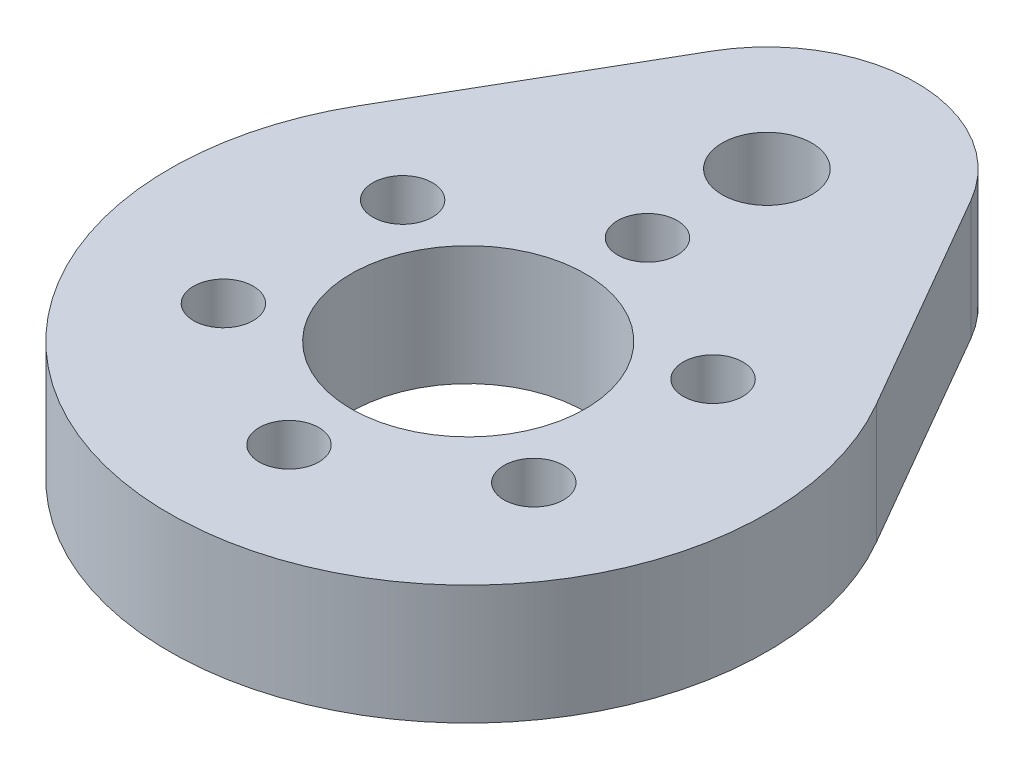
ISO-10303-21;
HEADER;
FILE_DESCRIPTION(('STEP AP214'),'2;1');
FILE_NAME('part.step','',(''),(''),'','','');
FILE_SCHEMA(('AUTOMOTIVE_DESIGN { 1 0 10303 214 1 1 1 1 }'));
ENDSEC;
DATA;
#1=APPLICATION_CONTEXT('core data for automotive mechanical design processes');
#2=APPLICATION_PROTOCOL_DEFINITION('international standard','automotive_design',2000,#1);
#3=PRODUCT_CONTEXT('',#1,'mechanical');
#4=PRODUCT('Part','Part','',(#3));
#5=PRODUCT_RELATED_PRODUCT_CATEGORY('part','',(#4));
#6=PRODUCT_DEFINITION_FORMATION('','',#4);
#7=PRODUCT_DEFINITION_CONTEXT('part definition',#1,'design');
#8=PRODUCT_DEFINITION('design','',#6,#7);
#9=PRODUCT_DEFINITION_SHAPE('','',#8);
#10=(LENGTH_UNIT() NAMED_UNIT(*) SI_UNIT(.MILLI.,.METRE.));
#11=(NAMED_UNIT(*) PLANE_ANGLE_UNIT() SI_UNIT($,.RADIAN.));
#12=(NAMED_UNIT(*) SI_UNIT($,.STERADIAN.) SOLID_ANGLE_UNIT());
#13=UNCERTAINTY_MEASURE_WITH_UNIT(LENGTH_MEASURE(1.E-05),#10,'distance_accuracy_value','');
#14=(GEOMETRIC_REPRESENTATION_CONTEXT(3) GLOBAL_UNCERTAINTY_ASSIGNED_CONTEXT((#13)) GLOBAL_UNIT_ASSIGNED_CONTEXT((#10,
#11,#12)) REPRESENTATION_CONTEXT('',''));
#15=CARTESIAN_POINT('',(0.,0.,0.));
#16=DIRECTION('',(0.,0.,1.));
#17=DIRECTION('',(1.,0.,0.));
#18=AXIS2_PLACEMENT_3D('',#15,#16,#17);
#19=CARTESIAN_POINT('',(0.,5.08,-12.7));
#20=DIRECTION('',(0.,1.,0.));
#21=DIRECTION('',(0.,0.,1.));
#22=AXIS2_PLACEMENT_3D('',#19,#20,#21);
#23=PLANE('',#22);
#24=CARTESIAN_POINT('',(-6.59911357683742,5.08,-3.80999999999999));
#25=DIRECTION('',(0.,1.,0.));
#26=DIRECTION('',(0.,0.,1.));
#27=AXIS2_PLACEMENT_3D('',#24,#25,#26);
#28=CIRCLE('',#27,1.27);
#29=CARTESIAN_POINT('',(-6.59911357683742,5.08,-2.53999999999999));
#30=VERTEX_POINT('',#29);
#31=EDGE_CURVE('E180',#30,#30,#28,.T.);
#32=ORIENTED_EDGE('',*,*,#31,.F.);
#33=EDGE_LOOP('',(#32));
#34=FACE_BOUND('',#33,.T.);
#35=CARTESIAN_POINT('',(0.,5.08,7.62));
#36=DIRECTION('',(0.,1.,0.));
#37=DIRECTION('',(0.,0.,1.));
#38=AXIS2_PLACEMENT_3D('',#35,#36,#37);
#39=CIRCLE('',#38,1.27);
#40=CARTESIAN_POINT('',(0.,5.08,8.89));
#41=VERTEX_POINT('',#40);
#42=EDGE_CURVE('E164',#41,#41,#39,.T.);
#43=ORIENTED_EDGE('',*,*,#42,.F.);
#44=EDGE_LOOP('',(#43));
#45=FACE_BOUND('',#44,.T.);
#46=CARTESIAN_POINT('',(6.59911357683742,5.08,-3.81));
#47=DIRECTION('',(0.,1.,0.));
#48=DIRECTION('',(0.,0.,1.));
#49=AXIS2_PLACEMENT_3D('',#46,#47,#48);
#50=CIRCLE('',#49,1.27);
#51=CARTESIAN_POINT('',(6.59911357683742,5.08,-2.54));
#52=VERTEX_POINT('',#51);
#53=EDGE_CURVE('E148',#52,#52,#50,.T.);
#54=ORIENTED_EDGE('',*,*,#53,.F.);
#55=EDGE_LOOP('',(#54));
#56=FACE_BOUND('',#55,.T.);
#57=CARTESIAN_POINT('',(0.,5.08,0.));
#58=DIRECTION('',(0.,1.,0.));
#59=DIRECTION('',(0.,0.,1.));
#60=AXIS2_PLACEMENT_3D('',#57,#58,#59);
#61=CIRCLE('',#60,4.97915669921389);
#62=CARTESIAN_POINT('',(0.,5.08,4.97915669921389));
#63=VERTEX_POINT('',#62);
#64=EDGE_CURVE('E118',#63,#63,#61,.T.);
#65=ORIENTED_EDGE('',*,*,#64,.F.);
#66=EDGE_LOOP('',(#65));
#67=FACE_BOUND('',#66,.T.);
#68=CARTESIAN_POINT('',(0.,5.08,-12.7));
#69=DIRECTION('',(0.,1.,0.));
#70=DIRECTION('',(0.,0.,1.));
#71=AXIS2_PLACEMENT_3D('',#68,#69,#70);
#72=CIRCLE('',#71,6.35);
#73=CARTESIAN_POINT('',(5.49926131403119,5.08,-15.875));
#74=VERTEX_POINT('',#73);
#75=CARTESIAN_POINT('',(-5.49926131403119,5.08,-15.875));
#76=VERTEX_POINT('',#75);
#77=EDGE_CURVE('E98',#74,#76,#72,.T.);
#78=ORIENTED_EDGE('',*,*,#77,.T.);
#79=DIRECTION('',(-0.5,0.,0.866025403784439));
#80=VECTOR('',#79,1.);
#81=CARTESIAN_POINT('',(-5.49926131403119,5.08,-15.875));
#82=LINE('',#81,#80);
#83=CARTESIAN_POINT('',(-10.9985226280624,5.08,-6.35));
#84=VERTEX_POINT('',#83);
#85=EDGE_CURVE('E93',#76,#84,#82,.T.);
#86=ORIENTED_EDGE('',*,*,#85,.T.);
#87=CARTESIAN_POINT('',(0.,5.08,0.));
#88=DIRECTION('',(0.,1.,0.));
#89=DIRECTION('',(0.,0.,1.));
#90=AXIS2_PLACEMENT_3D('',#87,#88,#89);
#91=CIRCLE('',#90,12.7);
#92=CARTESIAN_POINT('',(10.9985226280624,5.08,-6.35000000000001));
#93=VERTEX_POINT('',#92);
#94=EDGE_CURVE('E96',#84,#93,#91,.T.);
#95=ORIENTED_EDGE('',*,*,#94,.T.);
#96=DIRECTION('',(-0.5,0.,-0.866025403784439));
#97=VECTOR('',#96,1.);
#98=CARTESIAN_POINT('',(5.49926131403119,5.08,-15.875));
#99=LINE('',#98,#97);
#100=EDGE_CURVE('E63',#93,#74,#99,.T.);
#101=ORIENTED_EDGE('',*,*,#100,.T.);
#102=EDGE_LOOP('',(#78,#86,#95,#101));
#103=FACE_BOUND('',#102,.T.);
#104=CARTESIAN_POINT('',(0.,5.08,-7.62));
#105=DIRECTION('',(0.,1.,0.));
#106=DIRECTION('',(0.,0.,1.));
#107=AXIS2_PLACEMENT_3D('',#104,#105,#106);
#108=CIRCLE('',#107,1.27);
#109=CARTESIAN_POINT('',(0.,5.08,-6.35));
#110=VERTEX_POINT('',#109);
#111=EDGE_CURVE('E140',#110,#110,#108,.T.);
#112=ORIENTED_EDGE('',*,*,#111,.F.);
#113=EDGE_LOOP('',(#112));
#114=FACE_BOUND('',#113,.T.);
#115=CARTESIAN_POINT('',(6.59911357683742,5.08,3.81));
#116=DIRECTION('',(0.,1.,0.));
#117=DIRECTION('',(0.,0.,1.));
#118=AXIS2_PLACEMENT_3D('',#115,#116,#117);
#119=CIRCLE('',#118,1.27);
#120=CARTESIAN_POINT('',(6.59911357683742,5.08,5.08));
#121=VERTEX_POINT('',#120);
#122=EDGE_CURVE('E156',#121,#121,#119,.T.);
#123=ORIENTED_EDGE('',*,*,#122,.F.);
#124=EDGE_LOOP('',(#123));
#125=FACE_BOUND('',#124,.T.);
#126=CARTESIAN_POINT('',(-6.59911357683742,5.08,3.81));
#127=DIRECTION('',(0.,1.,0.));
#128=DIRECTION('',(0.,0.,1.));
#129=AXIS2_PLACEMENT_3D('',#126,#127,#128);
#130=CIRCLE('',#129,1.27);
#131=CARTESIAN_POINT('',(-6.59911357683742,5.08,5.08));
#132=VERTEX_POINT('',#131);
#133=EDGE_CURVE('E172',#132,#132,#130,.T.);
#134=ORIENTED_EDGE('',*,*,#133,.F.);
#135=EDGE_LOOP('',(#134));
#136=FACE_BOUND('',#135,.T.);
#137=CARTESIAN_POINT('',(0.,5.08,-12.7));
#138=DIRECTION('',(0.,1.,0.));
#139=DIRECTION('',(0.,0.,1.));
#140=AXIS2_PLACEMENT_3D('',#137,#138,#139);
#141=CIRCLE('',#140,1.905);
#142=CARTESIAN_POINT('',(0.,5.08,-10.795));
#143=VERTEX_POINT('',#142);
#144=EDGE_CURVE('E188',#143,#143,#141,.T.);
#145=ORIENTED_EDGE('',*,*,#144,.F.);
#146=EDGE_LOOP('',(#145));
#147=FACE_BOUND('',#146,.T.);
#148=ADVANCED_FACE('F45',(#34,#45,#56,#67,#103,#114,#125,#136,#147),#23,.T.);
#149=CARTESIAN_POINT('',(0.,0.,-12.7));
#150=DIRECTION('',(0.,1.,0.));
#151=DIRECTION('',(0.,0.,1.));
#152=AXIS2_PLACEMENT_3D('',#149,#150,#151);
#153=PLANE('',#152);
#154=CARTESIAN_POINT('',(0.,0.,-12.7));
#155=DIRECTION('',(0.,1.,0.));
#156=DIRECTION('',(0.,0.,1.));
#157=AXIS2_PLACEMENT_3D('',#154,#155,#156);
#158=CIRCLE('',#157,6.35);
#159=CARTESIAN_POINT('',(5.49926131403119,0.,-15.875));
#160=VERTEX_POINT('',#159);
#161=CARTESIAN_POINT('',(-5.49926131403119,0.,-15.875));
#162=VERTEX_POINT('',#161);
#163=EDGE_CURVE('E114',#160,#162,#158,.T.);
#164=ORIENTED_EDGE('',*,*,#163,.F.);
#165=DIRECTION('',(-0.5,0.,-0.866025403784439));
#166=VECTOR('',#165,1.);
#167=CARTESIAN_POINT('',(5.49926131403119,0.,-15.875));
#168=LINE('',#167,#166);
#169=CARTESIAN_POINT('',(10.9985226280624,0.,-6.35000000000001));
#170=VERTEX_POINT('',#169);
#171=EDGE_CURVE('E86',#170,#160,#168,.T.);
#172=ORIENTED_EDGE('',*,*,#171,.F.);
#173=CARTESIAN_POINT('',(0.,0.,0.));
#174=DIRECTION('',(0.,1.,0.));
#175=DIRECTION('',(0.,0.,1.));
#176=AXIS2_PLACEMENT_3D('',#173,#174,#175);
#177=CIRCLE('',#176,12.7);
#178=CARTESIAN_POINT('',(-10.9985226280624,0.,-6.35));
#179=VERTEX_POINT('',#178);
#180=EDGE_CURVE('E80',#179,#170,#177,.T.);
#181=ORIENTED_EDGE('',*,*,#180,.F.);
#182=DIRECTION('',(-0.5,0.,0.866025403784439));
#183=VECTOR('',#182,1.);
#184=CARTESIAN_POINT('',(-5.49926131403119,0.,-15.875));
#185=LINE('',#184,#183);
#186=EDGE_CURVE('E103',#162,#179,#185,.T.);
#187=ORIENTED_EDGE('',*,*,#186,.F.);
#188=EDGE_LOOP('',(#164,#172,#181,#187));
#189=FACE_BOUND('',#188,.T.);
#190=CARTESIAN_POINT('',(0.,0.,0.));
#191=DIRECTION('',(0.,1.,0.));
#192=DIRECTION('',(0.,0.,1.));
#193=AXIS2_PLACEMENT_3D('',#190,#191,#192);
#194=CIRCLE('',#193,4.97915669921389);
#195=CARTESIAN_POINT('',(0.,0.,4.97915669921389));
#196=VERTEX_POINT('',#195);
#197=EDGE_CURVE('E136',#196,#196,#194,.T.);
#198=ORIENTED_EDGE('',*,*,#197,.T.);
#199=EDGE_LOOP('',(#198));
#200=FACE_BOUND('',#199,.T.);
#201=CARTESIAN_POINT('',(0.,0.,-7.62));
#202=DIRECTION('',(0.,1.,0.));
#203=DIRECTION('',(0.,0.,1.));
#204=AXIS2_PLACEMENT_3D('',#201,#202,#203);
#205=CIRCLE('',#204,1.27);
#206=CARTESIAN_POINT('',(0.,0.,-6.35));
#207=VERTEX_POINT('',#206);
#208=EDGE_CURVE('E144',#207,#207,#205,.T.);
#209=ORIENTED_EDGE('',*,*,#208,.T.);
#210=EDGE_LOOP('',(#209));
#211=FACE_BOUND('',#210,.T.);
#212=CARTESIAN_POINT('',(6.59911357683742,0.,-3.81));
#213=DIRECTION('',(0.,1.,0.));
#214=DIRECTION('',(0.,0.,1.));
#215=AXIS2_PLACEMENT_3D('',#212,#213,#214);
#216=CIRCLE('',#215,1.27);
#217=CARTESIAN_POINT('',(6.59911357683742,0.,-2.54));
#218=VERTEX_POINT('',#217);
#219=EDGE_CURVE('E152',#218,#218,#216,.T.);
#220=ORIENTED_EDGE('',*,*,#219,.T.);
#221=EDGE_LOOP('',(#220));
#222=FACE_BOUND('',#221,.T.);
#223=CARTESIAN_POINT('',(6.59911357683742,0.,3.81));
#224=DIRECTION('',(0.,1.,0.));
#225=DIRECTION('',(0.,0.,1.));
#226=AXIS2_PLACEMENT_3D('',#223,#224,#225);
#227=CIRCLE('',#226,1.27);
#228=CARTESIAN_POINT('',(6.59911357683742,0.,5.08));
#229=VERTEX_POINT('',#228);
#230=EDGE_CURVE('E160',#229,#229,#227,.T.);
#231=ORIENTED_EDGE('',*,*,#230,.T.);
#232=EDGE_LOOP('',(#231));
#233=FACE_BOUND('',#232,.T.);
#234=CARTESIAN_POINT('',(0.,0.,7.62));
#235=DIRECTION('',(0.,1.,0.));
#236=DIRECTION('',(0.,0.,1.));
#237=AXIS2_PLACEMENT_3D('',#234,#235,#236);
#238=CIRCLE('',#237,1.27);
#239=CARTESIAN_POINT('',(0.,0.,8.89));
#240=VERTEX_POINT('',#239);
#241=EDGE_CURVE('E168',#240,#240,#238,.T.);
#242=ORIENTED_EDGE('',*,*,#241,.T.);
#243=EDGE_LOOP('',(#242));
#244=FACE_BOUND('',#243,.T.);
#245=CARTESIAN_POINT('',(-6.59911357683742,0.,3.81));
#246=DIRECTION('',(0.,1.,0.));
#247=DIRECTION('',(0.,0.,1.));
#248=AXIS2_PLACEMENT_3D('',#245,#246,#247);
#249=CIRCLE('',#248,1.27);
#250=CARTESIAN_POINT('',(-6.59911357683742,0.,5.08));
#251=VERTEX_POINT('',#250);
#252=EDGE_CURVE('E176',#251,#251,#249,.T.);
#253=ORIENTED_EDGE('',*,*,#252,.T.);
#254=EDGE_LOOP('',(#253));
#255=FACE_BOUND('',#254,.T.);
#256=CARTESIAN_POINT('',(-6.59911357683742,0.,-3.80999999999999));
#257=DIRECTION('',(0.,1.,0.));
#258=DIRECTION('',(0.,0.,1.));
#259=AXIS2_PLACEMENT_3D('',#256,#257,#258);
#260=CIRCLE('',#259,1.27);
#261=CARTESIAN_POINT('',(-6.59911357683742,0.,-2.53999999999999));
#262=VERTEX_POINT('',#261);
#263=EDGE_CURVE('E184',#262,#262,#260,.T.);
#264=ORIENTED_EDGE('',*,*,#263,.T.);
#265=EDGE_LOOP('',(#264));
#266=FACE_BOUND('',#265,.T.);
#267=CARTESIAN_POINT('',(0.,0.,-12.7));
#268=DIRECTION('',(0.,1.,0.));
#269=DIRECTION('',(0.,0.,1.));
#270=AXIS2_PLACEMENT_3D('',#267,#268,#269);
#271=CIRCLE('',#270,1.905);
#272=CARTESIAN_POINT('',(0.,0.,-10.795));
#273=VERTEX_POINT('',#272);
#274=EDGE_CURVE('E192',#273,#273,#271,.T.);
#275=ORIENTED_EDGE('',*,*,#274,.T.);
#276=EDGE_LOOP('',(#275));
#277=FACE_BOUND('',#276,.T.);
#278=ADVANCED_FACE('F131',(#189,#200,#211,#222,#233,#244,#255,#266,#277),#153,.F.);
#279=CARTESIAN_POINT('',(0.,5.08,-12.7));
#280=DIRECTION('',(0.,-1.,0.));
#281=DIRECTION('',(0.,0.,-1.));
#282=AXIS2_PLACEMENT_3D('',#279,#280,#281);
#283=CYLINDRICAL_SURFACE('',#282,6.35);
#284=ORIENTED_EDGE('',*,*,#163,.T.);
#285=DIRECTION('',(0.,-1.,0.));
#286=VECTOR('',#285,1.);
#287=CARTESIAN_POINT('',(-5.49926131403119,5.08,-15.875));
#288=LINE('',#287,#286);
#289=EDGE_CURVE('E11',#76,#162,#288,.T.);
#290=ORIENTED_EDGE('',*,*,#289,.F.);
#291=ORIENTED_EDGE('',*,*,#77,.F.);
#292=DIRECTION('',(0.,-1.,0.));
#293=VECTOR('',#292,1.);
#294=CARTESIAN_POINT('',(5.49926131403119,5.08,-15.875));
#295=LINE('',#294,#293);
#296=EDGE_CURVE('E110',#74,#160,#295,.T.);
#297=ORIENTED_EDGE('',*,*,#296,.T.);
#298=EDGE_LOOP('',(#284,#290,#291,#297));
#299=FACE_BOUND('',#298,.T.);
#300=ADVANCED_FACE('F47',(#299),#283,.T.);
#301=CARTESIAN_POINT('',(-5.49926131403119,5.08,-15.875));
#302=DIRECTION('',(0.866025403784439,0.,0.5));
#303=DIRECTION('',(0.5,0.,-0.866025403784439));
#304=AXIS2_PLACEMENT_3D('',#301,#302,#303);
#305=PLANE('',#304);
#306=ORIENTED_EDGE('',*,*,#186,.T.);
#307=DIRECTION('',(0.,-1.,0.));
#308=VECTOR('',#307,1.);
#309=CARTESIAN_POINT('',(-10.9985226280624,5.08,-6.35));
#310=LINE('',#309,#308);
#311=EDGE_CURVE('E55',#84,#179,#310,.T.);
#312=ORIENTED_EDGE('',*,*,#311,.F.);
#313=ORIENTED_EDGE('',*,*,#85,.F.);
#314=ORIENTED_EDGE('',*,*,#289,.T.);
#315=EDGE_LOOP('',(#306,#312,#313,#314));
#316=FACE_BOUND('',#315,.T.);
#317=ADVANCED_FACE('F102',(#316),#305,.F.);
#318=CARTESIAN_POINT('',(0.,5.08,0.));
#319=DIRECTION('',(0.,-1.,0.));
#320=DIRECTION('',(0.,0.,-1.));
#321=AXIS2_PLACEMENT_3D('',#318,#319,#320);
#322=CYLINDRICAL_SURFACE('',#321,12.7);
#323=ORIENTED_EDGE('',*,*,#180,.T.);
#324=DIRECTION('',(0.,-1.,0.));
#325=VECTOR('',#324,1.);
#326=CARTESIAN_POINT('',(10.9985226280624,5.08,-6.35000000000001));
#327=LINE('',#326,#325);
#328=EDGE_CURVE('E105',#93,#170,#327,.T.);
#329=ORIENTED_EDGE('',*,*,#328,.F.);
#330=ORIENTED_EDGE('',*,*,#94,.F.);
#331=ORIENTED_EDGE('',*,*,#311,.T.);
#332=EDGE_LOOP('',(#323,#329,#330,#331));
#333=FACE_BOUND('',#332,.T.);
#334=ADVANCED_FACE('F106',(#333),#322,.T.);
#335=CARTESIAN_POINT('',(5.49926131403119,5.08,-15.875));
#336=DIRECTION('',(-0.866025403784439,0.,0.5));
#337=DIRECTION('',(0.5,0.,0.866025403784439));
#338=AXIS2_PLACEMENT_3D('',#335,#336,#337);
#339=PLANE('',#338);
#340=ORIENTED_EDGE('',*,*,#171,.T.);
#341=ORIENTED_EDGE('',*,*,#296,.F.);
#342=ORIENTED_EDGE('',*,*,#100,.F.);
#343=ORIENTED_EDGE('',*,*,#328,.T.);
#344=EDGE_LOOP('',(#340,#341,#342,#343));
#345=FACE_BOUND('',#344,.T.);
#346=ADVANCED_FACE('F128',(#345),#339,.F.);
#347=CARTESIAN_POINT('',(0.,5.08,0.));
#348=DIRECTION('',(0.,-1.,0.));
#349=DIRECTION('',(0.,0.,-1.));
#350=AXIS2_PLACEMENT_3D('',#347,#348,#349);
#351=CYLINDRICAL_SURFACE('',#350,4.97915669921389);
#352=ORIENTED_EDGE('',*,*,#64,.T.);
#353=EDGE_LOOP('',(#352));
#354=FACE_BOUND('',#353,.T.);
#355=ORIENTED_EDGE('',*,*,#197,.F.);
#356=EDGE_LOOP('',(#355));
#357=FACE_BOUND('',#356,.T.);
#358=ADVANCED_FACE('F213',(#354,#357),#351,.F.);
#359=CARTESIAN_POINT('',(0.,5.08,-7.62));
#360=DIRECTION('',(0.,-1.,0.));
#361=DIRECTION('',(0.,0.,-1.));
#362=AXIS2_PLACEMENT_3D('',#359,#360,#361);
#363=CYLINDRICAL_SURFACE('',#362,1.27);
#364=ORIENTED_EDGE('',*,*,#111,.T.);
#365=EDGE_LOOP('',(#364));
#366=FACE_BOUND('',#365,.T.);
#367=ORIENTED_EDGE('',*,*,#208,.F.);
#368=EDGE_LOOP('',(#367));
#369=FACE_BOUND('',#368,.T.);
#370=ADVANCED_FACE('F258',(#366,#369),#363,.F.);
#371=CARTESIAN_POINT('',(6.59911357683742,5.08,-3.81));
#372=DIRECTION('',(0.,-1.,0.));
#373=DIRECTION('',(0.,0.,-1.));
#374=AXIS2_PLACEMENT_3D('',#371,#372,#373);
#375=CYLINDRICAL_SURFACE('',#374,1.27);
#376=ORIENTED_EDGE('',*,*,#53,.T.);
#377=EDGE_LOOP('',(#376));
#378=FACE_BOUND('',#377,.T.);
#379=ORIENTED_EDGE('',*,*,#219,.F.);
#380=EDGE_LOOP('',(#379));
#381=FACE_BOUND('',#380,.T.);
#382=ADVANCED_FACE('F266',(#378,#381),#375,.F.);
#383=CARTESIAN_POINT('',(6.59911357683742,5.08,3.81));
#384=DIRECTION('',(0.,-1.,0.));
#385=DIRECTION('',(0.,0.,-1.));
#386=AXIS2_PLACEMENT_3D('',#383,#384,#385);
#387=CYLINDRICAL_SURFACE('',#386,1.27);
#388=ORIENTED_EDGE('',*,*,#122,.T.);
#389=EDGE_LOOP('',(#388));
#390=FACE_BOUND('',#389,.T.);
#391=ORIENTED_EDGE('',*,*,#230,.F.);
#392=EDGE_LOOP('',(#391));
#393=FACE_BOUND('',#392,.T.);
#394=ADVANCED_FACE('F274',(#390,#393),#387,.F.);
#395=CARTESIAN_POINT('',(0.,5.08,7.62));
#396=DIRECTION('',(0.,-1.,0.));
#397=DIRECTION('',(0.,0.,-1.));
#398=AXIS2_PLACEMENT_3D('',#395,#396,#397);
#399=CYLINDRICAL_SURFACE('',#398,1.27);
#400=ORIENTED_EDGE('',*,*,#42,.T.);
#401=EDGE_LOOP('',(#400));
#402=FACE_BOUND('',#401,.T.);
#403=ORIENTED_EDGE('',*,*,#241,.F.);
#404=EDGE_LOOP('',(#403));
#405=FACE_BOUND('',#404,.T.);
#406=ADVANCED_FACE('F283',(#402,#405),#399,.F.);
#407=CARTESIAN_POINT('',(-6.59911357683742,5.08,3.81));
#408=DIRECTION('',(0.,-1.,0.));
#409=DIRECTION('',(0.,0.,-1.));
#410=AXIS2_PLACEMENT_3D('',#407,#408,#409);
#411=CYLINDRICAL_SURFACE('',#410,1.27);
#412=ORIENTED_EDGE('',*,*,#133,.T.);
#413=EDGE_LOOP('',(#412));
#414=FACE_BOUND('',#413,.T.);
#415=ORIENTED_EDGE('',*,*,#252,.F.);
#416=EDGE_LOOP('',(#415));
#417=FACE_BOUND('',#416,.T.);
#418=ADVANCED_FACE('F292',(#414,#417),#411,.F.);
#419=CARTESIAN_POINT('',(-6.59911357683742,5.08,-3.80999999999999));
#420=DIRECTION('',(0.,-1.,0.));
#421=DIRECTION('',(0.,0.,-1.));
#422=AXIS2_PLACEMENT_3D('',#419,#420,#421);
#423=CYLINDRICAL_SURFACE('',#422,1.27);
#424=ORIENTED_EDGE('',*,*,#31,.T.);
#425=EDGE_LOOP('',(#424));
#426=FACE_BOUND('',#425,.T.);
#427=ORIENTED_EDGE('',*,*,#263,.F.);
#428=EDGE_LOOP('',(#427));
#429=FACE_BOUND('',#428,.T.);
#430=ADVANCED_FACE('F301',(#426,#429),#423,.F.);
#431=CARTESIAN_POINT('',(0.,5.08,-12.7));
#432=DIRECTION('',(0.,-1.,0.));
#433=DIRECTION('',(0.,0.,-1.));
#434=AXIS2_PLACEMENT_3D('',#431,#432,#433);
#435=CYLINDRICAL_SURFACE('',#434,1.905);
#436=ORIENTED_EDGE('',*,*,#144,.T.);
#437=EDGE_LOOP('',(#436));
#438=FACE_BOUND('',#437,.T.);
#439=ORIENTED_EDGE('',*,*,#274,.F.);
#440=EDGE_LOOP('',(#439));
#441=FACE_BOUND('',#440,.T.);
#442=ADVANCED_FACE('F200',(#438,#441),#435,.F.);
#443=CLOSED_SHELL('',(#148,#278,#300,#317,#334,#346,#358,#370,#382,#394,#406,#418,#430,#442));
#444=MANIFOLD_SOLID_BREP('B2',#443);
#445=ADVANCED_BREP_SHAPE_REPRESENTATION('',(#18,#444),#14);
#446=SHAPE_DEFINITION_REPRESENTATION(#9,#445);
ENDSEC;
END-ISO-10303-21;
